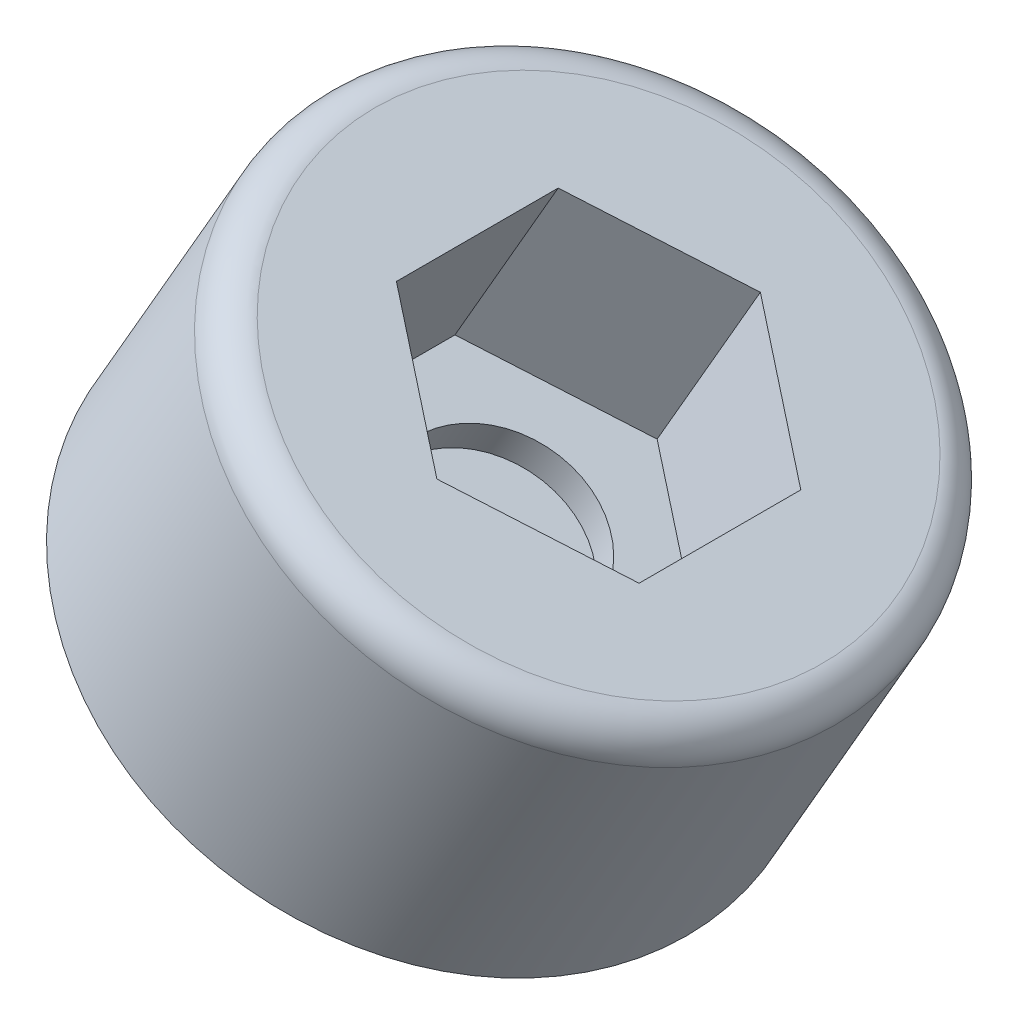
ISO-10303-21;
HEADER;
FILE_DESCRIPTION(('STEP AP214'),'2;1');
FILE_NAME('part.step','',(''),(''),'','','');
FILE_SCHEMA(('AUTOMOTIVE_DESIGN { 1 0 10303 214 1 1 1 1 }'));
ENDSEC;
DATA;
#1=APPLICATION_CONTEXT('core data for automotive mechanical design processes');
#2=APPLICATION_PROTOCOL_DEFINITION('international standard','automotive_design',2000,#1);
#3=PRODUCT_CONTEXT('',#1,'mechanical');
#4=PRODUCT('Part','Part','',(#3));
#5=PRODUCT_RELATED_PRODUCT_CATEGORY('part','',(#4));
#6=PRODUCT_DEFINITION_FORMATION('','',#4);
#7=PRODUCT_DEFINITION_CONTEXT('part definition',#1,'design');
#8=PRODUCT_DEFINITION('design','',#6,#7);
#9=PRODUCT_DEFINITION_SHAPE('','',#8);
#10=(LENGTH_UNIT() NAMED_UNIT(*) SI_UNIT(.MILLI.,.METRE.));
#11=(NAMED_UNIT(*) PLANE_ANGLE_UNIT() SI_UNIT($,.RADIAN.));
#12=(NAMED_UNIT(*) SI_UNIT($,.STERADIAN.) SOLID_ANGLE_UNIT());
#13=UNCERTAINTY_MEASURE_WITH_UNIT(LENGTH_MEASURE(1.E-05),#10,'distance_accuracy_value','');
#14=(GEOMETRIC_REPRESENTATION_CONTEXT(3) GLOBAL_UNCERTAINTY_ASSIGNED_CONTEXT((#13)) GLOBAL_UNIT_ASSIGNED_CONTEXT((#10,
#11,#12)) REPRESENTATION_CONTEXT('',''));
#15=CARTESIAN_POINT('',(0.,0.,0.));
#16=DIRECTION('',(0.,0.,1.));
#17=DIRECTION('',(1.,0.,0.));
#18=AXIS2_PLACEMENT_3D('',#15,#16,#17);
#19=CARTESIAN_POINT('',(37.79422863406,47.4615242270665,35.04));
#20=DIRECTION('',(0.5,0.866025403784439,0.));
#21=DIRECTION('',(-0.866025403784439,0.5,0.));
#22=AXIS2_PLACEMENT_3D('',#19,#20,#21);
#23=PLANE('',#22);
#24=CARTESIAN_POINT('',(37.79422863406,47.4615242270665,34.));
#25=DIRECTION('',(-0.5,-0.866025403784439,0.));
#26=DIRECTION('',(0.866025403784439,-0.5,0.));
#27=AXIS2_PLACEMENT_3D('',#24,#25,#26);
#28=CIRCLE('',#27,1.04);
#29=CARTESIAN_POINT('',(38.6948950539958,46.9415242270665,34.));
#30=VERTEX_POINT('',#29);
#31=EDGE_CURVE('E20',#30,#30,#28,.F.);
#32=ORIENTED_EDGE('',*,*,#31,.T.);
#33=EDGE_LOOP('',(#32));
#34=FACE_BOUND('',#33,.T.);
#35=ADVANCED_FACE('F17',(#34),#23,.T.);
#36=CARTESIAN_POINT('',(39.19422863406,49.8863953576629,34.));
#37=DIRECTION('',(-0.5,-0.866025403784439,0.));
#38=DIRECTION('',(0.866025403784439,-0.5,0.));
#39=AXIS2_PLACEMENT_3D('',#36,#37,#38);
#40=CYLINDRICAL_SURFACE('',#39,1.04);
#41=ORIENTED_EDGE('',*,*,#31,.F.);
#42=EDGE_LOOP('',(#41));
#43=FACE_BOUND('',#42,.T.);
#44=CARTESIAN_POINT('',(37.99422863406,47.8079343885802,34.));
#45=DIRECTION('',(-0.5,-0.866025403784439,0.));
#46=DIRECTION('',(0.866025403784439,-0.5,0.));
#47=AXIS2_PLACEMENT_3D('',#44,#45,#46);
#48=CIRCLE('',#47,1.04);
#49=CARTESIAN_POINT('',(38.8948950539958,47.2879343885802,34.));
#50=VERTEX_POINT('',#49);
#51=EDGE_CURVE('E81',#50,#50,#48,.F.);
#52=ORIENTED_EDGE('',*,*,#51,.T.);
#53=EDGE_LOOP('',(#52));
#54=FACE_BOUND('',#53,.T.);
#55=ADVANCED_FACE('F107',(#43,#54),#40,.F.);
#56=CARTESIAN_POINT('',(37.9942286340599,47.8079343885802,32.12));
#57=DIRECTION('',(-0.5,-0.866025403784439,0.));
#58=DIRECTION('',(0.866025403784439,-0.5,0.));
#59=AXIS2_PLACEMENT_3D('',#56,#57,#58);
#60=PLANE('',#59);
#61=DIRECTION('',(0.,0.,1.));
#62=VECTOR('',#61,1.);
#63=CARTESIAN_POINT('',(36.58422863406,48.6219982681376,33.06));
#64=LINE('',#63,#62);
#65=CARTESIAN_POINT('',(36.58422863406,48.6219982681376,33.06));
#66=VERTEX_POINT('',#65);
#67=CARTESIAN_POINT('',(36.58422863406,48.6219982681376,34.94));
#68=VERTEX_POINT('',#67);
#69=EDGE_CURVE('E289',#66,#68,#64,.T.);
#70=ORIENTED_EDGE('',*,*,#69,.T.);
#71=DIRECTION('',(0.749999999999979,-0.433012701892254,0.5));
#72=VECTOR('',#71,1.);
#73=CARTESIAN_POINT('',(36.58422863406,48.6219982681376,34.94));
#74=LINE('',#73,#72);
#75=CARTESIAN_POINT('',(37.9942286340599,47.8079343885802,35.88));
#76=VERTEX_POINT('',#75);
#77=EDGE_CURVE('E302',#68,#76,#74,.T.);
#78=ORIENTED_EDGE('',*,*,#77,.T.);
#79=DIRECTION('',(0.750000000000016,-0.43301270189219,-0.5));
#80=VECTOR('',#79,1.);
#81=CARTESIAN_POINT('',(37.9942286340599,47.8079343885802,35.88));
#82=LINE('',#81,#80);
#83=CARTESIAN_POINT('',(39.4042286340599,46.9938705090229,34.94));
#84=VERTEX_POINT('',#83);
#85=EDGE_CURVE('E274',#76,#84,#82,.T.);
#86=ORIENTED_EDGE('',*,*,#85,.T.);
#87=DIRECTION('',(0.,0.,1.));
#88=VECTOR('',#87,1.);
#89=CARTESIAN_POINT('',(39.4042286340599,46.9938705090229,34.94));
#90=LINE('',#89,#88);
#91=CARTESIAN_POINT('',(39.40422863406,46.9938705090229,33.06));
#92=VERTEX_POINT('',#91);
#93=EDGE_CURVE('E86',#84,#92,#90,.F.);
#94=ORIENTED_EDGE('',*,*,#93,.T.);
#95=DIRECTION('',(-0.750000000000029,0.433012701892167,-0.5));
#96=VECTOR('',#95,1.);
#97=CARTESIAN_POINT('',(39.4042286340601,46.9938705090229,33.06));
#98=LINE('',#97,#96);
#99=CARTESIAN_POINT('',(37.9942286340599,47.8079343885802,32.12));
#100=VERTEX_POINT('',#99);
#101=EDGE_CURVE('E67',#92,#100,#98,.T.);
#102=ORIENTED_EDGE('',*,*,#101,.T.);
#103=DIRECTION('',(-0.749999999999975,0.433012701892254,0.500000000000008));
#104=VECTOR('',#103,1.);
#105=CARTESIAN_POINT('',(37.9942286340599,47.8079343885802,32.12));
#106=LINE('',#105,#104);
#107=EDGE_CURVE('E72',#100,#66,#106,.T.);
#108=ORIENTED_EDGE('',*,*,#107,.T.);
#109=EDGE_LOOP('',(#70,#78,#86,#94,#102,#108));
#110=FACE_BOUND('',#109,.T.);
#111=ORIENTED_EDGE('',*,*,#51,.F.);
#112=EDGE_LOOP('',(#111));
#113=FACE_BOUND('',#112,.T.);
#114=ADVANCED_FACE('F83',(#110,#113),#60,.F.);
#115=CARTESIAN_POINT('',(39.19422863406,49.8863953576629,32.12));
#116=DIRECTION('',(-0.433012701892225,0.25,-0.866025403784436));
#117=DIRECTION('',(-0.894427190999913,0.,0.447213595499963));
#118=AXIS2_PLACEMENT_3D('',#115,#116,#117);
#119=PLANE('',#118);
#120=DIRECTION('',(0.500000000000016,0.866025403784429,0.));
#121=VECTOR('',#120,1.);
#122=CARTESIAN_POINT('',(37.99422863406,47.8079343885802,32.12));
#123=LINE('',#122,#121);
#124=CARTESIAN_POINT('',(39.19422863406,49.8863953576629,32.12));
#125=VERTEX_POINT('',#124);
#126=EDGE_CURVE('E74',#100,#125,#123,.T.);
#127=ORIENTED_EDGE('',*,*,#126,.T.);
#128=DIRECTION('',(0.75,-0.43301270189222,-0.5));
#129=VECTOR('',#128,1.);
#130=CARTESIAN_POINT('',(37.78422863406,50.7004592372203,33.06));
#131=LINE('',#130,#129);
#132=CARTESIAN_POINT('',(37.78422863406,50.7004592372203,33.06));
#133=VERTEX_POINT('',#132);
#134=EDGE_CURVE('E285',#133,#125,#131,.T.);
#135=ORIENTED_EDGE('',*,*,#134,.F.);
#136=DIRECTION('',(-0.5,-0.866025403784439,0.));
#137=VECTOR('',#136,1.);
#138=CARTESIAN_POINT('',(37.78422863406,50.7004592372203,33.06));
#139=LINE('',#138,#137);
#140=EDGE_CURVE('E77',#133,#66,#139,.T.);
#141=ORIENTED_EDGE('',*,*,#140,.T.);
#142=ORIENTED_EDGE('',*,*,#107,.F.);
#143=EDGE_LOOP('',(#127,#135,#141,#142));
#144=FACE_BOUND('',#143,.T.);
#145=ADVANCED_FACE('F73',(#144),#119,.F.);
#146=CARTESIAN_POINT('',(40.6042286340601,49.0723314781055,33.06));
#147=DIRECTION('',(0.433012701892222,-0.25,-0.866025403784437));
#148=DIRECTION('',(-0.894427190999914,0.,-0.447213595499961));
#149=AXIS2_PLACEMENT_3D('',#146,#147,#148);
#150=PLANE('',#149);
#151=DIRECTION('',(0.5,0.866025403784439,0.));
#152=VECTOR('',#151,1.);
#153=CARTESIAN_POINT('',(40.60422863406,49.0723314781056,33.06));
#154=LINE('',#153,#152);
#155=CARTESIAN_POINT('',(40.6042286340601,49.0723314781055,33.06));
#156=VERTEX_POINT('',#155);
#157=EDGE_CURVE('E88',#92,#156,#154,.T.);
#158=ORIENTED_EDGE('',*,*,#157,.T.);
#159=DIRECTION('',(0.750000000000013,-0.433012701892226,0.499999999999974));
#160=VECTOR('',#159,1.);
#161=CARTESIAN_POINT('',(39.19422863406,49.8863953576629,32.12));
#162=LINE('',#161,#160);
#163=EDGE_CURVE('E92',#125,#156,#162,.T.);
#164=ORIENTED_EDGE('',*,*,#163,.F.);
#165=ORIENTED_EDGE('',*,*,#126,.F.);
#166=ORIENTED_EDGE('',*,*,#101,.F.);
#167=EDGE_LOOP('',(#158,#164,#165,#166));
#168=FACE_BOUND('',#167,.T.);
#169=ADVANCED_FACE('F90',(#168),#150,.F.);
#170=CARTESIAN_POINT('',(40.60422863406,49.0723314781056,34.94));
#171=DIRECTION('',(0.866025403784439,-0.5,0.));
#172=DIRECTION('',(0.5,0.866025403784439,0.));
#173=AXIS2_PLACEMENT_3D('',#170,#171,#172);
#174=PLANE('',#173);
#175=DIRECTION('',(0.500000000000017,0.866025403784429,0.));
#176=VECTOR('',#175,1.);
#177=CARTESIAN_POINT('',(39.4042286340599,46.9938705090229,34.94));
#178=LINE('',#177,#176);
#179=CARTESIAN_POINT('',(40.60422863406,49.0723314781056,34.94));
#180=VERTEX_POINT('',#179);
#181=EDGE_CURVE('E270',#84,#180,#178,.T.);
#182=ORIENTED_EDGE('',*,*,#181,.T.);
#183=DIRECTION('',(0.,0.,1.));
#184=VECTOR('',#183,1.);
#185=CARTESIAN_POINT('',(40.6042286340601,49.0723314781055,37.4));
#186=LINE('',#185,#184);
#187=EDGE_CURVE('E273',#156,#180,#186,.T.);
#188=ORIENTED_EDGE('',*,*,#187,.F.);
#189=ORIENTED_EDGE('',*,*,#157,.F.);
#190=ORIENTED_EDGE('',*,*,#93,.F.);
#191=EDGE_LOOP('',(#182,#188,#189,#190));
#192=FACE_BOUND('',#191,.T.);
#193=ADVANCED_FACE('F171',(#192),#174,.F.);
#194=CARTESIAN_POINT('',(39.19422863406,49.8863953576629,35.88));
#195=DIRECTION('',(0.433012701892225,-0.25,0.866025403784436));
#196=DIRECTION('',(0.894427190999913,0.,-0.447213595499963));
#197=AXIS2_PLACEMENT_3D('',#194,#195,#196);
#198=PLANE('',#197);
#199=DIRECTION('',(0.500000000000016,0.866025403784429,0.));
#200=VECTOR('',#199,1.);
#201=CARTESIAN_POINT('',(37.9942286340599,47.8079343885802,35.88));
#202=LINE('',#201,#200);
#203=CARTESIAN_POINT('',(39.19422863406,49.8863953576629,35.88));
#204=VERTEX_POINT('',#203);
#205=EDGE_CURVE('E279',#76,#204,#202,.T.);
#206=ORIENTED_EDGE('',*,*,#205,.T.);
#207=DIRECTION('',(-0.75,0.433012701892217,0.50000000000001));
#208=VECTOR('',#207,1.);
#209=CARTESIAN_POINT('',(40.60422863406,49.0723314781056,34.94));
#210=LINE('',#209,#208);
#211=EDGE_CURVE('E277',#180,#204,#210,.T.);
#212=ORIENTED_EDGE('',*,*,#211,.F.);
#213=ORIENTED_EDGE('',*,*,#181,.F.);
#214=ORIENTED_EDGE('',*,*,#85,.F.);
#215=EDGE_LOOP('',(#206,#212,#213,#214));
#216=FACE_BOUND('',#215,.T.);
#217=ADVANCED_FACE('F168',(#216),#198,.F.);
#218=CARTESIAN_POINT('',(37.7842286340599,50.7004592372203,34.94));
#219=DIRECTION('',(-0.433012701892222,0.25,0.866025403784437));
#220=DIRECTION('',(0.894427190999914,0.,0.447213595499961));
#221=AXIS2_PLACEMENT_3D('',#218,#219,#220);
#222=PLANE('',#221);
#223=DIRECTION('',(-0.5,-0.866025403784439,0.));
#224=VECTOR('',#223,1.);
#225=CARTESIAN_POINT('',(37.78422863406,50.7004592372203,34.94));
#226=LINE('',#225,#224);
#227=CARTESIAN_POINT('',(37.7842286340599,50.7004592372203,34.94));
#228=VERTEX_POINT('',#227);
#229=EDGE_CURVE('E35',#68,#228,#226,.F.);
#230=ORIENTED_EDGE('',*,*,#229,.T.);
#231=DIRECTION('',(-0.75000000000001,0.433012701892227,-0.499999999999979));
#232=VECTOR('',#231,1.);
#233=CARTESIAN_POINT('',(39.19422863406,49.8863953576629,35.88));
#234=LINE('',#233,#232);
#235=EDGE_CURVE('E282',#204,#228,#234,.T.);
#236=ORIENTED_EDGE('',*,*,#235,.F.);
#237=ORIENTED_EDGE('',*,*,#205,.F.);
#238=ORIENTED_EDGE('',*,*,#77,.F.);
#239=EDGE_LOOP('',(#230,#236,#237,#238));
#240=FACE_BOUND('',#239,.T.);
#241=ADVANCED_FACE('F164',(#240),#222,.F.);
#242=CARTESIAN_POINT('',(37.78422863406,50.7004592372203,33.06));
#243=DIRECTION('',(-0.866025403784439,0.5,0.));
#244=DIRECTION('',(-0.5,-0.866025403784439,0.));
#245=AXIS2_PLACEMENT_3D('',#242,#243,#244);
#246=PLANE('',#245);
#247=ORIENTED_EDGE('',*,*,#140,.F.);
#248=DIRECTION('',(0.,0.,1.));
#249=VECTOR('',#248,1.);
#250=CARTESIAN_POINT('',(37.7842286340599,50.7004592372203,37.4));
#251=LINE('',#250,#249);
#252=EDGE_CURVE('E150',#228,#133,#251,.F.);
#253=ORIENTED_EDGE('',*,*,#252,.F.);
#254=ORIENTED_EDGE('',*,*,#229,.F.);
#255=ORIENTED_EDGE('',*,*,#69,.F.);
#256=EDGE_LOOP('',(#247,#253,#254,#255));
#257=FACE_BOUND('',#256,.T.);
#258=ADVANCED_FACE('F161',(#257),#246,.F.);
#259=CARTESIAN_POINT('',(39.19422863406,49.8863953576629,37.4));
#260=DIRECTION('',(0.5,0.866025403784439,0.));
#261=DIRECTION('',(-0.866025403784439,0.5,0.));
#262=AXIS2_PLACEMENT_3D('',#259,#260,#261);
#263=PLANE('',#262);
#264=CARTESIAN_POINT('',(39.1942286340599,49.8863953576629,34.));
#265=DIRECTION('',(-0.5,-0.866025403784439,0.));
#266=DIRECTION('',(0.,0.,1.));
#267=AXIS2_PLACEMENT_3D('',#264,#265,#266);
#268=CIRCLE('',#267,3.);
#269=CARTESIAN_POINT('',(39.19422863406,49.8863953576628,37.));
#270=VERTEX_POINT('',#269);
#271=EDGE_CURVE('E99',#270,#270,#268,.T.);
#272=ORIENTED_EDGE('',*,*,#271,.F.);
#273=EDGE_LOOP('',(#272));
#274=FACE_BOUND('',#273,.T.);
#275=ORIENTED_EDGE('',*,*,#235,.T.);
#276=ORIENTED_EDGE('',*,*,#252,.T.);
#277=ORIENTED_EDGE('',*,*,#134,.T.);
#278=ORIENTED_EDGE('',*,*,#163,.T.);
#279=ORIENTED_EDGE('',*,*,#187,.T.);
#280=ORIENTED_EDGE('',*,*,#211,.T.);
#281=EDGE_LOOP('',(#275,#276,#277,#278,#279,#280));
#282=FACE_BOUND('',#281,.T.);
#283=ADVANCED_FACE('F152',(#274,#282),#263,.T.);
#284=CARTESIAN_POINT('',(37.19422863406,46.4222937425251,34.));
#285=DIRECTION('',(0.5,0.866025403784439,0.));
#286=DIRECTION('',(-0.866025403784439,0.5,0.));
#287=AXIS2_PLACEMENT_3D('',#284,#285,#286);
#288=PLANE('',#287);
#289=CARTESIAN_POINT('',(37.194228634092,46.4222937425805,34.));
#290=DIRECTION('',(0.5,0.866025403784439,0.));
#291=DIRECTION('',(-0.866025403784439,0.5,0.));
#292=AXIS2_PLACEMENT_3D('',#289,#290,#291);
#293=CIRCLE('',#292,3.24000000001343);
#294=CARTESIAN_POINT('',(34.3883063258188,48.0422937425872,34.));
#295=VERTEX_POINT('',#294);
#296=EDGE_CURVE('E97',#295,#295,#293,.T.);
#297=ORIENTED_EDGE('',*,*,#296,.F.);
#298=EDGE_LOOP('',(#297));
#299=FACE_BOUND('',#298,.T.);
#300=ADVANCED_FACE('F134',(#299),#288,.F.);
#301=CARTESIAN_POINT('',(38.9942286340599,49.5399851961491,34.));
#302=DIRECTION('',(0.5,0.866025403784439,0.));
#303=DIRECTION('',(0.,0.,-1.));
#304=AXIS2_PLACEMENT_3D('',#301,#302,#303);
#305=TOROIDAL_SURFACE('',#304,3.,0.4);
#306=CARTESIAN_POINT('',(38.99422863406,49.5399851961491,34.));
#307=DIRECTION('',(0.5,0.866025403784439,0.));
#308=DIRECTION('',(-0.866025403784439,0.5,0.));
#309=AXIS2_PLACEMENT_3D('',#306,#307,#308);
#310=CIRCLE('',#309,3.4);
#311=CARTESIAN_POINT('',(36.0497422611929,51.2399851961491,34.));
#312=VERTEX_POINT('',#311);
#313=EDGE_CURVE('E26',#312,#312,#310,.F.);
#314=ORIENTED_EDGE('',*,*,#313,.F.);
#315=EDGE_LOOP('',(#314));
#316=FACE_BOUND('',#315,.T.);
#317=ORIENTED_EDGE('',*,*,#271,.T.);
#318=EDGE_LOOP('',(#317));
#319=FACE_BOUND('',#318,.T.);
#320=ADVANCED_FACE('F125',(#316,#319),#305,.T.);
#321=CARTESIAN_POINT('',(37.2742286340057,46.5608578070365,34.));
#322=DIRECTION('',(0.5,0.866025403784439,0.));
#323=DIRECTION('',(-0.866025403784439,0.5,0.));
#324=AXIS2_PLACEMENT_3D('',#321,#322,#323);
#325=CONICAL_SURFACE('',#324,3.39999999989368,0.785398163562809);
#326=CARTESIAN_POINT('',(37.2742286340601,46.5608578071307,34.));
#327=DIRECTION('',(0.5,0.866025403784439,0.));
#328=DIRECTION('',(-0.866025403784439,0.5,0.));
#329=AXIS2_PLACEMENT_3D('',#326,#327,#328);
#330=CIRCLE('',#329,3.4);
#331=CARTESIAN_POINT('',(34.329742261193,48.2608578071307,34.));
#332=VERTEX_POINT('',#331);
#333=EDGE_CURVE('E11',#332,#332,#330,.T.);
#334=ORIENTED_EDGE('',*,*,#333,.F.);
#335=EDGE_LOOP('',(#334));
#336=FACE_BOUND('',#335,.T.);
#337=ORIENTED_EDGE('',*,*,#296,.T.);
#338=EDGE_LOOP('',(#337));
#339=FACE_BOUND('',#338,.T.);
#340=ADVANCED_FACE('F118',(#336,#339),#325,.T.);
#341=CARTESIAN_POINT('',(37.19422863406,46.4222937425251,34.));
#342=DIRECTION('',(0.5,0.866025403784439,0.));
#343=DIRECTION('',(-0.866025403784439,0.5,0.));
#344=AXIS2_PLACEMENT_3D('',#341,#342,#343);
#345=CYLINDRICAL_SURFACE('',#344,3.4);
#346=ORIENTED_EDGE('',*,*,#333,.T.);
#347=EDGE_LOOP('',(#346));
#348=FACE_BOUND('',#347,.T.);
#349=ORIENTED_EDGE('',*,*,#313,.T.);
#350=EDGE_LOOP('',(#349));
#351=FACE_BOUND('',#350,.T.);
#352=ADVANCED_FACE('F116',(#348,#351),#345,.T.);
#353=CLOSED_SHELL('',(#35,#55,#114,#145,#169,#193,#217,#241,#258,#283,#300,#320,#340,#352));
#354=MANIFOLD_SOLID_BREP('B1',#353);
#355=ADVANCED_BREP_SHAPE_REPRESENTATION('',(#18,#354),#14);
#356=SHAPE_DEFINITION_REPRESENTATION(#9,#355);
ENDSEC;
END-ISO-10303-21;
